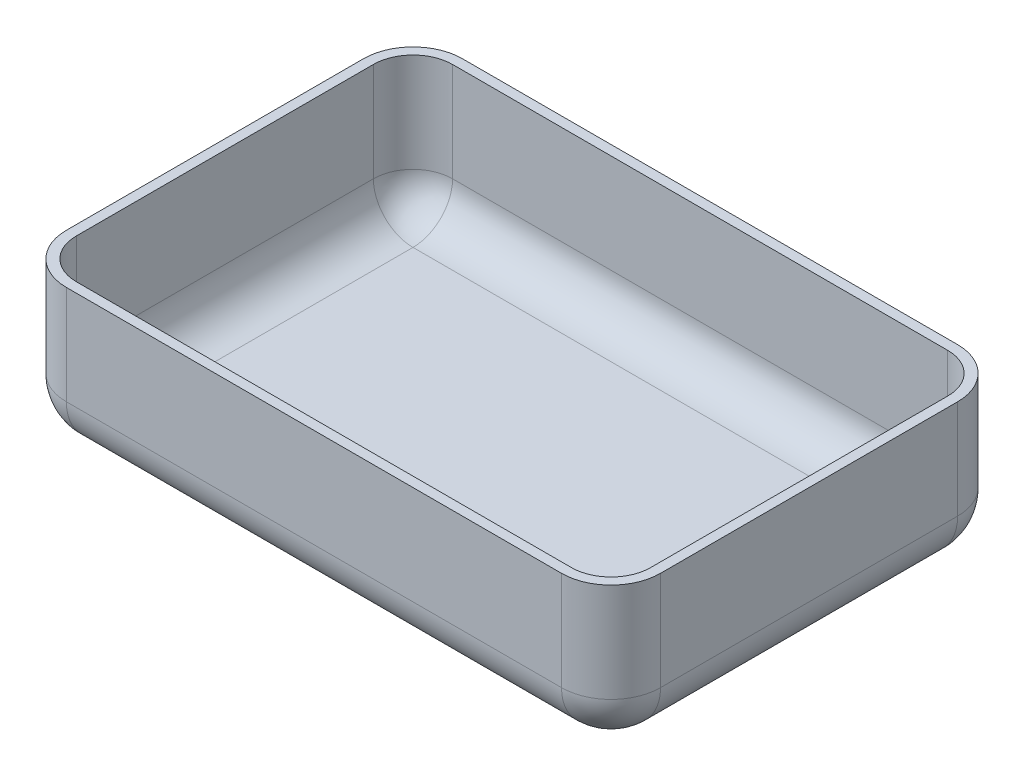
ISO-10303-21;
HEADER;
FILE_DESCRIPTION(('STEP AP214'),'2;1');
FILE_NAME('part.step','',(''),(''),'','','');
FILE_SCHEMA(('AUTOMOTIVE_DESIGN { 1 0 10303 214 1 1 1 1 }'));
ENDSEC;
DATA;
#1=APPLICATION_CONTEXT('core data for automotive mechanical design processes');
#2=APPLICATION_PROTOCOL_DEFINITION('international standard','automotive_design',2000,#1);
#3=PRODUCT_CONTEXT('',#1,'mechanical');
#4=PRODUCT('Part','Part','',(#3));
#5=PRODUCT_RELATED_PRODUCT_CATEGORY('part','',(#4));
#6=PRODUCT_DEFINITION_FORMATION('','',#4);
#7=PRODUCT_DEFINITION_CONTEXT('part definition',#1,'design');
#8=PRODUCT_DEFINITION('design','',#6,#7);
#9=PRODUCT_DEFINITION_SHAPE('','',#8);
#10=(LENGTH_UNIT() NAMED_UNIT(*) SI_UNIT(.MILLI.,.METRE.));
#11=(NAMED_UNIT(*) PLANE_ANGLE_UNIT() SI_UNIT($,.RADIAN.));
#12=(NAMED_UNIT(*) SI_UNIT($,.STERADIAN.) SOLID_ANGLE_UNIT());
#13=UNCERTAINTY_MEASURE_WITH_UNIT(LENGTH_MEASURE(1.E-05),#10,'distance_accuracy_value','');
#14=(GEOMETRIC_REPRESENTATION_CONTEXT(3) GLOBAL_UNCERTAINTY_ASSIGNED_CONTEXT((#13)) GLOBAL_UNIT_ASSIGNED_CONTEXT((#10,
#11,#12)) REPRESENTATION_CONTEXT('',''));
#15=CARTESIAN_POINT('',(0.,0.,0.));
#16=DIRECTION('',(0.,0.,1.));
#17=DIRECTION('',(1.,0.,0.));
#18=AXIS2_PLACEMENT_3D('',#15,#16,#17);
#19=CARTESIAN_POINT('',(-76.2,38.1,50.8));
#20=DIRECTION('',(1.,0.,0.));
#21=DIRECTION('',(0.,0.,-1.));
#22=AXIS2_PLACEMENT_3D('',#19,#20,#21);
#23=PLANE('',#22);
#24=DIRECTION('',(0.,0.,1.));
#25=VECTOR('',#24,1.);
#26=CARTESIAN_POINT('',(-76.2,38.1,50.8));
#27=LINE('',#26,#25);
#28=CARTESIAN_POINT('',(-76.2,38.1,-38.1));
#29=VERTEX_POINT('',#28);
#30=CARTESIAN_POINT('',(-76.2,38.1,38.1));
#31=VERTEX_POINT('',#30);
#32=EDGE_CURVE('E282',#29,#31,#27,.T.);
#33=ORIENTED_EDGE('',*,*,#32,.F.);
#34=DIRECTION('',(0.,-1.,0.));
#35=VECTOR('',#34,1.);
#36=CARTESIAN_POINT('',(-76.2,38.1,-38.1));
#37=LINE('',#36,#35);
#38=CARTESIAN_POINT('',(-76.2,12.7,-38.1));
#39=VERTEX_POINT('',#38);
#40=EDGE_CURVE('E299',#29,#39,#37,.T.);
#41=ORIENTED_EDGE('',*,*,#40,.T.);
#42=DIRECTION('',(0.,0.,1.));
#43=VECTOR('',#42,1.);
#44=CARTESIAN_POINT('',(-76.2,12.7,50.8));
#45=LINE('',#44,#43);
#46=CARTESIAN_POINT('',(-76.2,12.7,38.1));
#47=VERTEX_POINT('',#46);
#48=EDGE_CURVE('E296',#39,#47,#45,.T.);
#49=ORIENTED_EDGE('',*,*,#48,.T.);
#50=DIRECTION('',(0.,-1.,0.));
#51=VECTOR('',#50,1.);
#52=CARTESIAN_POINT('',(-76.2,38.1,38.1));
#53=LINE('',#52,#51);
#54=EDGE_CURVE('E294',#47,#31,#53,.F.);
#55=ORIENTED_EDGE('',*,*,#54,.T.);
#56=EDGE_LOOP('',(#33,#41,#49,#55));
#57=FACE_BOUND('',#56,.T.);
#58=ADVANCED_FACE('F39',(#57),#23,.F.);
#59=CARTESIAN_POINT('',(76.2,38.1,50.8));
#60=DIRECTION('',(0.,0.,-1.));
#61=DIRECTION('',(-1.,0.,0.));
#62=AXIS2_PLACEMENT_3D('',#59,#60,#61);
#63=PLANE('',#62);
#64=DIRECTION('',(1.,0.,0.));
#65=VECTOR('',#64,1.);
#66=CARTESIAN_POINT('',(76.2,12.7,50.8));
#67=LINE('',#66,#65);
#68=CARTESIAN_POINT('',(-63.5,12.7,50.8));
#69=VERTEX_POINT('',#68);
#70=CARTESIAN_POINT('',(63.5,12.7,50.8));
#71=VERTEX_POINT('',#70);
#72=EDGE_CURVE('E64',#69,#71,#67,.T.);
#73=ORIENTED_EDGE('',*,*,#72,.T.);
#74=DIRECTION('',(0.,-1.,0.));
#75=VECTOR('',#74,1.);
#76=CARTESIAN_POINT('',(63.5,38.1,50.8));
#77=LINE('',#76,#75);
#78=CARTESIAN_POINT('',(63.5,38.1,50.8));
#79=VERTEX_POINT('',#78);
#80=EDGE_CURVE('E325',#71,#79,#77,.F.);
#81=ORIENTED_EDGE('',*,*,#80,.T.);
#82=DIRECTION('',(1.,0.,0.));
#83=VECTOR('',#82,1.);
#84=CARTESIAN_POINT('',(76.2,38.1,50.8));
#85=LINE('',#84,#83);
#86=CARTESIAN_POINT('',(-63.5,38.1,50.8));
#87=VERTEX_POINT('',#86);
#88=EDGE_CURVE('E285',#87,#79,#85,.T.);
#89=ORIENTED_EDGE('',*,*,#88,.F.);
#90=DIRECTION('',(0.,-1.,0.));
#91=VECTOR('',#90,1.);
#92=CARTESIAN_POINT('',(-63.5,38.1,50.8));
#93=LINE('',#92,#91);
#94=EDGE_CURVE('E322',#87,#69,#93,.T.);
#95=ORIENTED_EDGE('',*,*,#94,.T.);
#96=EDGE_LOOP('',(#73,#81,#89,#95));
#97=FACE_BOUND('',#96,.T.);
#98=ADVANCED_FACE('F398',(#97),#63,.F.);
#99=CARTESIAN_POINT('',(76.2,38.1,50.8));
#100=DIRECTION('',(-1.,0.,0.));
#101=DIRECTION('',(0.,0.,1.));
#102=AXIS2_PLACEMENT_3D('',#99,#100,#101);
#103=PLANE('',#102);
#104=DIRECTION('',(0.,0.,-1.));
#105=VECTOR('',#104,1.);
#106=CARTESIAN_POINT('',(76.2,12.7,50.8));
#107=LINE('',#106,#105);
#108=CARTESIAN_POINT('',(76.2,12.7,38.1));
#109=VERTEX_POINT('',#108);
#110=CARTESIAN_POINT('',(76.2,12.7,-38.1));
#111=VERTEX_POINT('',#110);
#112=EDGE_CURVE('E318',#109,#111,#107,.T.);
#113=ORIENTED_EDGE('',*,*,#112,.T.);
#114=DIRECTION('',(0.,-1.,0.));
#115=VECTOR('',#114,1.);
#116=CARTESIAN_POINT('',(76.2,38.1,-38.1));
#117=LINE('',#116,#115);
#118=CARTESIAN_POINT('',(76.2,38.1,-38.1));
#119=VERTEX_POINT('',#118);
#120=EDGE_CURVE('E320',#111,#119,#117,.F.);
#121=ORIENTED_EDGE('',*,*,#120,.T.);
#122=DIRECTION('',(0.,0.,-1.));
#123=VECTOR('',#122,1.);
#124=CARTESIAN_POINT('',(76.2,38.1,50.8));
#125=LINE('',#124,#123);
#126=CARTESIAN_POINT('',(76.2,38.1,38.1));
#127=VERTEX_POINT('',#126);
#128=EDGE_CURVE('E288',#127,#119,#125,.T.);
#129=ORIENTED_EDGE('',*,*,#128,.F.);
#130=DIRECTION('',(0.,-1.,0.));
#131=VECTOR('',#130,1.);
#132=CARTESIAN_POINT('',(76.2,38.1,38.1));
#133=LINE('',#132,#131);
#134=EDGE_CURVE('E316',#127,#109,#133,.T.);
#135=ORIENTED_EDGE('',*,*,#134,.T.);
#136=EDGE_LOOP('',(#113,#121,#129,#135));
#137=FACE_BOUND('',#136,.T.);
#138=ADVANCED_FACE('F417',(#137),#103,.F.);
#139=CARTESIAN_POINT('',(76.2,38.1,-50.8));
#140=DIRECTION('',(0.,0.,1.));
#141=DIRECTION('',(1.,0.,0.));
#142=AXIS2_PLACEMENT_3D('',#139,#140,#141);
#143=PLANE('',#142);
#144=DIRECTION('',(-1.,0.,0.));
#145=VECTOR('',#144,1.);
#146=CARTESIAN_POINT('',(76.2,12.7,-50.8));
#147=LINE('',#146,#145);
#148=CARTESIAN_POINT('',(63.5,12.7,-50.8));
#149=VERTEX_POINT('',#148);
#150=CARTESIAN_POINT('',(-63.5,12.7,-50.8));
#151=VERTEX_POINT('',#150);
#152=EDGE_CURVE('E312',#149,#151,#147,.T.);
#153=ORIENTED_EDGE('',*,*,#152,.T.);
#154=DIRECTION('',(0.,-1.,0.));
#155=VECTOR('',#154,1.);
#156=CARTESIAN_POINT('',(-63.5,38.1,-50.8));
#157=LINE('',#156,#155);
#158=CARTESIAN_POINT('',(-63.5,38.1,-50.8));
#159=VERTEX_POINT('',#158);
#160=EDGE_CURVE('E314',#151,#159,#157,.F.);
#161=ORIENTED_EDGE('',*,*,#160,.T.);
#162=DIRECTION('',(-1.,0.,0.));
#163=VECTOR('',#162,1.);
#164=CARTESIAN_POINT('',(76.2,38.1,-50.8));
#165=LINE('',#164,#163);
#166=CARTESIAN_POINT('',(63.5,38.1,-50.8));
#167=VERTEX_POINT('',#166);
#168=EDGE_CURVE('E291',#167,#159,#165,.T.);
#169=ORIENTED_EDGE('',*,*,#168,.F.);
#170=DIRECTION('',(0.,-1.,0.));
#171=VECTOR('',#170,1.);
#172=CARTESIAN_POINT('',(63.5,38.1,-50.8));
#173=LINE('',#172,#171);
#174=EDGE_CURVE('E310',#167,#149,#173,.T.);
#175=ORIENTED_EDGE('',*,*,#174,.T.);
#176=EDGE_LOOP('',(#153,#161,#169,#175));
#177=FACE_BOUND('',#176,.T.);
#178=ADVANCED_FACE('F376',(#177),#143,.F.);
#179=CARTESIAN_POINT('',(0.,38.1,0.));
#180=DIRECTION('',(0.,1.,0.));
#181=DIRECTION('',(0.,0.,1.));
#182=AXIS2_PLACEMENT_3D('',#179,#180,#181);
#183=PLANE('',#182);
#184=DIRECTION('',(-1.,0.,0.));
#185=VECTOR('',#184,1.);
#186=CARTESIAN_POINT('',(76.2,38.1,-48.26));
#187=LINE('',#186,#185);
#188=CARTESIAN_POINT('',(63.5,38.1,-48.26));
#189=VERTEX_POINT('',#188);
#190=CARTESIAN_POINT('',(-63.5,38.1,-48.26));
#191=VERTEX_POINT('',#190);
#192=EDGE_CURVE('E215',#189,#191,#187,.T.);
#193=ORIENTED_EDGE('',*,*,#192,.F.);
#194=CARTESIAN_POINT('',(63.5,38.1,-38.1));
#195=DIRECTION('',(0.,1.,0.));
#196=DIRECTION('',(0.,0.,1.));
#197=AXIS2_PLACEMENT_3D('',#194,#195,#196);
#198=CIRCLE('',#197,10.16);
#199=CARTESIAN_POINT('',(73.66,38.1,-38.1));
#200=VERTEX_POINT('',#199);
#201=EDGE_CURVE('E275',#200,#189,#198,.T.);
#202=ORIENTED_EDGE('',*,*,#201,.F.);
#203=DIRECTION('',(0.,0.,-1.));
#204=VECTOR('',#203,1.);
#205=CARTESIAN_POINT('',(73.66,38.1,50.8));
#206=LINE('',#205,#204);
#207=CARTESIAN_POINT('',(73.66,38.1,38.1));
#208=VERTEX_POINT('',#207);
#209=EDGE_CURVE('E56',#208,#200,#206,.T.);
#210=ORIENTED_EDGE('',*,*,#209,.F.);
#211=CARTESIAN_POINT('',(63.5,38.1,38.1));
#212=DIRECTION('',(0.,1.,0.));
#213=DIRECTION('',(0.,0.,1.));
#214=AXIS2_PLACEMENT_3D('',#211,#212,#213);
#215=CIRCLE('',#214,10.16);
#216=CARTESIAN_POINT('',(63.5,38.1,48.26));
#217=VERTEX_POINT('',#216);
#218=EDGE_CURVE('E271',#217,#208,#215,.T.);
#219=ORIENTED_EDGE('',*,*,#218,.F.);
#220=DIRECTION('',(1.,0.,0.));
#221=VECTOR('',#220,1.);
#222=CARTESIAN_POINT('',(76.2,38.1,48.26));
#223=LINE('',#222,#221);
#224=CARTESIAN_POINT('',(-63.5,38.1,48.26));
#225=VERTEX_POINT('',#224);
#226=EDGE_CURVE('E269',#225,#217,#223,.T.);
#227=ORIENTED_EDGE('',*,*,#226,.F.);
#228=CARTESIAN_POINT('',(-63.5,38.1,38.1));
#229=DIRECTION('',(0.,1.,0.));
#230=DIRECTION('',(0.,0.,1.));
#231=AXIS2_PLACEMENT_3D('',#228,#229,#230);
#232=CIRCLE('',#231,10.16);
#233=CARTESIAN_POINT('',(-73.66,38.1,38.1));
#234=VERTEX_POINT('',#233);
#235=EDGE_CURVE('E238',#234,#225,#232,.T.);
#236=ORIENTED_EDGE('',*,*,#235,.F.);
#237=DIRECTION('',(0.,0.,1.));
#238=VECTOR('',#237,1.);
#239=CARTESIAN_POINT('',(-73.66,38.1,50.8));
#240=LINE('',#239,#238);
#241=CARTESIAN_POINT('',(-73.66,38.1,-38.1));
#242=VERTEX_POINT('',#241);
#243=EDGE_CURVE('E259',#242,#234,#240,.T.);
#244=ORIENTED_EDGE('',*,*,#243,.F.);
#245=CARTESIAN_POINT('',(-63.5,38.1,-38.1));
#246=DIRECTION('',(0.,1.,0.));
#247=DIRECTION('',(0.,0.,1.));
#248=AXIS2_PLACEMENT_3D('',#245,#246,#247);
#249=CIRCLE('',#248,10.16);
#250=EDGE_CURVE('E184',#191,#242,#249,.T.);
#251=ORIENTED_EDGE('',*,*,#250,.F.);
#252=EDGE_LOOP('',(#193,#202,#210,#219,#227,#236,#244,#251));
#253=FACE_BOUND('',#252,.T.);
#254=ORIENTED_EDGE('',*,*,#168,.T.);
#255=CARTESIAN_POINT('',(-63.5,38.1,-38.1));
#256=DIRECTION('',(0.,1.,0.));
#257=DIRECTION('',(0.,0.,1.));
#258=AXIS2_PLACEMENT_3D('',#255,#256,#257);
#259=CIRCLE('',#258,12.7);
#260=EDGE_CURVE('E11',#159,#29,#259,.T.);
#261=ORIENTED_EDGE('',*,*,#260,.T.);
#262=ORIENTED_EDGE('',*,*,#32,.T.);
#263=CARTESIAN_POINT('',(-63.5,38.1,38.1));
#264=DIRECTION('',(0.,1.,0.));
#265=DIRECTION('',(0.,0.,1.));
#266=AXIS2_PLACEMENT_3D('',#263,#264,#265);
#267=CIRCLE('',#266,12.7);
#268=EDGE_CURVE('E327',#31,#87,#267,.T.);
#269=ORIENTED_EDGE('',*,*,#268,.T.);
#270=ORIENTED_EDGE('',*,*,#88,.T.);
#271=CARTESIAN_POINT('',(63.5,38.1,38.1));
#272=DIRECTION('',(0.,1.,0.));
#273=DIRECTION('',(0.,0.,1.));
#274=AXIS2_PLACEMENT_3D('',#271,#272,#273);
#275=CIRCLE('',#274,12.7);
#276=EDGE_CURVE('E329',#79,#127,#275,.T.);
#277=ORIENTED_EDGE('',*,*,#276,.T.);
#278=ORIENTED_EDGE('',*,*,#128,.T.);
#279=CARTESIAN_POINT('',(63.5,38.1,-38.1));
#280=DIRECTION('',(0.,1.,0.));
#281=DIRECTION('',(0.,0.,1.));
#282=AXIS2_PLACEMENT_3D('',#279,#280,#281);
#283=CIRCLE('',#282,12.7);
#284=EDGE_CURVE('E48',#119,#167,#283,.T.);
#285=ORIENTED_EDGE('',*,*,#284,.T.);
#286=EDGE_LOOP('',(#254,#261,#262,#269,#270,#277,#278,#285));
#287=FACE_BOUND('',#286,.T.);
#288=ADVANCED_FACE('F387',(#253,#287),#183,.T.);
#289=CARTESIAN_POINT('',(0.,0.,0.));
#290=DIRECTION('',(0.,1.,0.));
#291=DIRECTION('',(0.,0.,1.));
#292=AXIS2_PLACEMENT_3D('',#289,#290,#291);
#293=PLANE('',#292);
#294=DIRECTION('',(1.,0.,0.));
#295=VECTOR('',#294,1.);
#296=CARTESIAN_POINT('',(0.,0.,38.1));
#297=LINE('',#296,#295);
#298=CARTESIAN_POINT('',(63.5,0.,38.1));
#299=VERTEX_POINT('',#298);
#300=CARTESIAN_POINT('',(-63.5,0.,38.1));
#301=VERTEX_POINT('',#300);
#302=EDGE_CURVE('E301',#299,#301,#297,.F.);
#303=ORIENTED_EDGE('',*,*,#302,.T.);
#304=DIRECTION('',(0.,0.,1.));
#305=VECTOR('',#304,1.);
#306=CARTESIAN_POINT('',(-63.5,0.,0.));
#307=LINE('',#306,#305);
#308=CARTESIAN_POINT('',(-63.5,0.,-38.1));
#309=VERTEX_POINT('',#308);
#310=EDGE_CURVE('E307',#301,#309,#307,.F.);
#311=ORIENTED_EDGE('',*,*,#310,.T.);
#312=DIRECTION('',(-1.,0.,0.));
#313=VECTOR('',#312,1.);
#314=CARTESIAN_POINT('',(0.,0.,-38.1));
#315=LINE('',#314,#313);
#316=CARTESIAN_POINT('',(63.5,0.,-38.1));
#317=VERTEX_POINT('',#316);
#318=EDGE_CURVE('E305',#309,#317,#315,.F.);
#319=ORIENTED_EDGE('',*,*,#318,.T.);
#320=DIRECTION('',(0.,0.,-1.));
#321=VECTOR('',#320,1.);
#322=CARTESIAN_POINT('',(63.5,0.,0.));
#323=LINE('',#322,#321);
#324=EDGE_CURVE('E303',#317,#299,#323,.F.);
#325=ORIENTED_EDGE('',*,*,#324,.T.);
#326=EDGE_LOOP('',(#303,#311,#319,#325));
#327=FACE_BOUND('',#326,.T.);
#328=ADVANCED_FACE('F413',(#327),#293,.F.);
#329=CARTESIAN_POINT('',(63.5,38.1,-38.1));
#330=DIRECTION('',(0.,-1.,0.));
#331=DIRECTION('',(0.,0.,-1.));
#332=AXIS2_PLACEMENT_3D('',#329,#330,#331);
#333=CYLINDRICAL_SURFACE('',#332,12.7);
#334=ORIENTED_EDGE('',*,*,#284,.F.);
#335=ORIENTED_EDGE('',*,*,#120,.F.);
#336=CARTESIAN_POINT('',(63.5,12.7,-38.1));
#337=DIRECTION('',(0.,-1.,0.));
#338=DIRECTION('',(0.,0.,-1.));
#339=AXIS2_PLACEMENT_3D('',#336,#337,#338);
#340=CIRCLE('',#339,12.7);
#341=EDGE_CURVE('E358',#149,#111,#340,.T.);
#342=ORIENTED_EDGE('',*,*,#341,.F.);
#343=ORIENTED_EDGE('',*,*,#174,.F.);
#344=EDGE_LOOP('',(#334,#335,#342,#343));
#345=FACE_BOUND('',#344,.T.);
#346=ADVANCED_FACE('F41',(#345),#333,.T.);
#347=CARTESIAN_POINT('',(63.5,38.1,38.1));
#348=DIRECTION('',(0.,-1.,0.));
#349=DIRECTION('',(0.,0.,-1.));
#350=AXIS2_PLACEMENT_3D('',#347,#348,#349);
#351=CYLINDRICAL_SURFACE('',#350,12.7);
#352=ORIENTED_EDGE('',*,*,#276,.F.);
#353=ORIENTED_EDGE('',*,*,#80,.F.);
#354=CARTESIAN_POINT('',(63.5,12.7,38.1));
#355=DIRECTION('',(0.,-1.,0.));
#356=DIRECTION('',(0.,0.,-1.));
#357=AXIS2_PLACEMENT_3D('',#354,#355,#356);
#358=CIRCLE('',#357,12.7);
#359=EDGE_CURVE('E356',#109,#71,#358,.T.);
#360=ORIENTED_EDGE('',*,*,#359,.F.);
#361=ORIENTED_EDGE('',*,*,#134,.F.);
#362=EDGE_LOOP('',(#352,#353,#360,#361));
#363=FACE_BOUND('',#362,.T.);
#364=ADVANCED_FACE('F401',(#363),#351,.T.);
#365=CARTESIAN_POINT('',(63.5,12.7,50.8));
#366=DIRECTION('',(0.,0.,-1.));
#367=DIRECTION('',(-1.,0.,0.));
#368=AXIS2_PLACEMENT_3D('',#365,#366,#367);
#369=CYLINDRICAL_SURFACE('',#368,12.7);
#370=CARTESIAN_POINT('',(63.5,12.7,-38.1));
#371=DIRECTION('',(0.,0.,-1.));
#372=DIRECTION('',(-1.,0.,0.));
#373=AXIS2_PLACEMENT_3D('',#370,#371,#372);
#374=CIRCLE('',#373,12.7);
#375=EDGE_CURVE('E43',#111,#317,#374,.T.);
#376=ORIENTED_EDGE('',*,*,#375,.F.);
#377=ORIENTED_EDGE('',*,*,#112,.F.);
#378=CARTESIAN_POINT('',(63.5,12.7,38.1));
#379=DIRECTION('',(0.,0.,1.));
#380=DIRECTION('',(1.,0.,0.));
#381=AXIS2_PLACEMENT_3D('',#378,#379,#380);
#382=CIRCLE('',#381,12.7);
#383=EDGE_CURVE('E353',#299,#109,#382,.T.);
#384=ORIENTED_EDGE('',*,*,#383,.F.);
#385=ORIENTED_EDGE('',*,*,#324,.F.);
#386=EDGE_LOOP('',(#376,#377,#384,#385));
#387=FACE_BOUND('',#386,.T.);
#388=ADVANCED_FACE('F414',(#387),#369,.T.);
#389=CARTESIAN_POINT('',(63.5,12.7,-38.1));
#390=DIRECTION('',(1.,0.,0.));
#391=DIRECTION('',(0.,0.,-1.));
#392=AXIS2_PLACEMENT_3D('',#389,#390,#391);
#393=SPHERICAL_SURFACE('',#392,12.7);
#394=ORIENTED_EDGE('',*,*,#341,.T.);
#395=ORIENTED_EDGE('',*,*,#375,.T.);
#396=CARTESIAN_POINT('',(63.5,12.7,-38.1));
#397=DIRECTION('',(1.,0.,0.));
#398=DIRECTION('',(0.,0.,-1.));
#399=AXIS2_PLACEMENT_3D('',#396,#397,#398);
#400=CIRCLE('',#399,12.7);
#401=EDGE_CURVE('E350',#149,#317,#400,.F.);
#402=ORIENTED_EDGE('',*,*,#401,.F.);
#403=EDGE_LOOP('',(#394,#395,#402));
#404=FACE_BOUND('',#403,.T.);
#405=ADVANCED_FACE('F365',(#404),#393,.T.);
#406=CARTESIAN_POINT('',(63.5,12.7,38.1));
#407=DIRECTION('',(1.,0.,0.));
#408=DIRECTION('',(0.,0.,-1.));
#409=AXIS2_PLACEMENT_3D('',#406,#407,#408);
#410=SPHERICAL_SURFACE('',#409,12.7);
#411=ORIENTED_EDGE('',*,*,#383,.T.);
#412=ORIENTED_EDGE('',*,*,#359,.T.);
#413=CARTESIAN_POINT('',(63.5,12.7,38.1));
#414=DIRECTION('',(1.,0.,0.));
#415=DIRECTION('',(0.,0.,-1.));
#416=AXIS2_PLACEMENT_3D('',#413,#414,#415);
#417=CIRCLE('',#416,12.7);
#418=EDGE_CURVE('E347',#299,#71,#417,.F.);
#419=ORIENTED_EDGE('',*,*,#418,.F.);
#420=EDGE_LOOP('',(#411,#412,#419));
#421=FACE_BOUND('',#420,.T.);
#422=ADVANCED_FACE('F405',(#421),#410,.T.);
#423=CARTESIAN_POINT('',(76.2,12.7,-38.1));
#424=DIRECTION('',(-1.,0.,0.));
#425=DIRECTION('',(0.,0.,1.));
#426=AXIS2_PLACEMENT_3D('',#423,#424,#425);
#427=CYLINDRICAL_SURFACE('',#426,12.7);
#428=ORIENTED_EDGE('',*,*,#401,.T.);
#429=ORIENTED_EDGE('',*,*,#318,.F.);
#430=CARTESIAN_POINT('',(-63.5,12.7,-38.1));
#431=DIRECTION('',(-1.,0.,0.));
#432=DIRECTION('',(0.,0.,1.));
#433=AXIS2_PLACEMENT_3D('',#430,#431,#432);
#434=CIRCLE('',#433,12.7);
#435=EDGE_CURVE('E344',#151,#309,#434,.T.);
#436=ORIENTED_EDGE('',*,*,#435,.F.);
#437=ORIENTED_EDGE('',*,*,#152,.F.);
#438=EDGE_LOOP('',(#428,#429,#436,#437));
#439=FACE_BOUND('',#438,.T.);
#440=ADVANCED_FACE('F372',(#439),#427,.T.);
#441=CARTESIAN_POINT('',(-63.5,38.1,-38.1));
#442=DIRECTION('',(0.,-1.,0.));
#443=DIRECTION('',(0.,0.,-1.));
#444=AXIS2_PLACEMENT_3D('',#441,#442,#443);
#445=CYLINDRICAL_SURFACE('',#444,12.7);
#446=ORIENTED_EDGE('',*,*,#260,.F.);
#447=ORIENTED_EDGE('',*,*,#160,.F.);
#448=CARTESIAN_POINT('',(-63.5,12.7,-38.1));
#449=DIRECTION('',(0.,-1.,0.));
#450=DIRECTION('',(0.,0.,-1.));
#451=AXIS2_PLACEMENT_3D('',#448,#449,#450);
#452=CIRCLE('',#451,12.7);
#453=EDGE_CURVE('E341',#39,#151,#452,.T.);
#454=ORIENTED_EDGE('',*,*,#453,.F.);
#455=ORIENTED_EDGE('',*,*,#40,.F.);
#456=EDGE_LOOP('',(#446,#447,#454,#455));
#457=FACE_BOUND('',#456,.T.);
#458=ADVANCED_FACE('F382',(#457),#445,.T.);
#459=CARTESIAN_POINT('',(-63.5,38.1,38.1));
#460=DIRECTION('',(0.,-1.,0.));
#461=DIRECTION('',(0.,0.,-1.));
#462=AXIS2_PLACEMENT_3D('',#459,#460,#461);
#463=CYLINDRICAL_SURFACE('',#462,12.7);
#464=ORIENTED_EDGE('',*,*,#268,.F.);
#465=ORIENTED_EDGE('',*,*,#54,.F.);
#466=CARTESIAN_POINT('',(-63.5,12.7,38.1));
#467=DIRECTION('',(0.,-1.,0.));
#468=DIRECTION('',(0.,0.,-1.));
#469=AXIS2_PLACEMENT_3D('',#466,#467,#468);
#470=CIRCLE('',#469,12.7);
#471=EDGE_CURVE('E338',#69,#47,#470,.T.);
#472=ORIENTED_EDGE('',*,*,#471,.F.);
#473=ORIENTED_EDGE('',*,*,#94,.F.);
#474=EDGE_LOOP('',(#464,#465,#472,#473));
#475=FACE_BOUND('',#474,.T.);
#476=ADVANCED_FACE('F394',(#475),#463,.T.);
#477=CARTESIAN_POINT('',(76.2,12.7,38.1));
#478=DIRECTION('',(1.,0.,0.));
#479=DIRECTION('',(0.,0.,-1.));
#480=AXIS2_PLACEMENT_3D('',#477,#478,#479);
#481=CYLINDRICAL_SURFACE('',#480,12.7);
#482=ORIENTED_EDGE('',*,*,#418,.T.);
#483=ORIENTED_EDGE('',*,*,#72,.F.);
#484=CARTESIAN_POINT('',(-63.5,12.7,38.1));
#485=DIRECTION('',(-1.,0.,0.));
#486=DIRECTION('',(0.,0.,1.));
#487=AXIS2_PLACEMENT_3D('',#484,#485,#486);
#488=CIRCLE('',#487,12.7);
#489=EDGE_CURVE('E335',#301,#69,#488,.T.);
#490=ORIENTED_EDGE('',*,*,#489,.F.);
#491=ORIENTED_EDGE('',*,*,#302,.F.);
#492=EDGE_LOOP('',(#482,#483,#490,#491));
#493=FACE_BOUND('',#492,.T.);
#494=ADVANCED_FACE('F409',(#493),#481,.T.);
#495=CARTESIAN_POINT('',(-63.5,12.7,-38.1));
#496=DIRECTION('',(0.,0.,-1.));
#497=DIRECTION('',(-1.,0.,0.));
#498=AXIS2_PLACEMENT_3D('',#495,#496,#497);
#499=SPHERICAL_SURFACE('',#498,12.7);
#500=ORIENTED_EDGE('',*,*,#453,.T.);
#501=ORIENTED_EDGE('',*,*,#435,.T.);
#502=CARTESIAN_POINT('',(-63.5,12.7,-38.1));
#503=DIRECTION('',(0.,0.,-1.));
#504=DIRECTION('',(-1.,0.,0.));
#505=AXIS2_PLACEMENT_3D('',#502,#503,#504);
#506=CIRCLE('',#505,12.7);
#507=EDGE_CURVE('E333',#39,#309,#506,.F.);
#508=ORIENTED_EDGE('',*,*,#507,.F.);
#509=EDGE_LOOP('',(#500,#501,#508));
#510=FACE_BOUND('',#509,.T.);
#511=ADVANCED_FACE('F442',(#510),#499,.T.);
#512=CARTESIAN_POINT('',(-63.5,12.7,38.1));
#513=DIRECTION('',(0.,0.,1.));
#514=DIRECTION('',(1.,0.,0.));
#515=AXIS2_PLACEMENT_3D('',#512,#513,#514);
#516=SPHERICAL_SURFACE('',#515,12.7);
#517=ORIENTED_EDGE('',*,*,#489,.T.);
#518=ORIENTED_EDGE('',*,*,#471,.T.);
#519=CARTESIAN_POINT('',(-63.5,12.7,38.1));
#520=DIRECTION('',(0.,0.,1.));
#521=DIRECTION('',(1.,0.,0.));
#522=AXIS2_PLACEMENT_3D('',#519,#520,#521);
#523=CIRCLE('',#522,12.7);
#524=EDGE_CURVE('E281',#301,#47,#523,.F.);
#525=ORIENTED_EDGE('',*,*,#524,.F.);
#526=EDGE_LOOP('',(#517,#518,#525));
#527=FACE_BOUND('',#526,.T.);
#528=ADVANCED_FACE('F438',(#527),#516,.T.);
#529=CARTESIAN_POINT('',(-63.5,12.7,50.8));
#530=DIRECTION('',(0.,0.,1.));
#531=DIRECTION('',(1.,0.,0.));
#532=AXIS2_PLACEMENT_3D('',#529,#530,#531);
#533=CYLINDRICAL_SURFACE('',#532,12.7);
#534=ORIENTED_EDGE('',*,*,#507,.T.);
#535=ORIENTED_EDGE('',*,*,#310,.F.);
#536=ORIENTED_EDGE('',*,*,#524,.T.);
#537=ORIENTED_EDGE('',*,*,#48,.F.);
#538=EDGE_LOOP('',(#534,#535,#536,#537));
#539=FACE_BOUND('',#538,.T.);
#540=ADVANCED_FACE('F435',(#539),#533,.T.);
#541=CARTESIAN_POINT('',(-73.66,38.1,50.8));
#542=DIRECTION('',(1.,0.,0.));
#543=DIRECTION('',(0.,0.,-1.));
#544=AXIS2_PLACEMENT_3D('',#541,#542,#543);
#545=PLANE('',#544);
#546=ORIENTED_EDGE('',*,*,#243,.T.);
#547=DIRECTION('',(0.,1.,0.));
#548=VECTOR('',#547,1.);
#549=CARTESIAN_POINT('',(-73.66,38.1,38.1));
#550=LINE('',#549,#548);
#551=CARTESIAN_POINT('',(-73.66,12.7,38.1));
#552=VERTEX_POINT('',#551);
#553=EDGE_CURVE('E213',#552,#234,#550,.T.);
#554=ORIENTED_EDGE('',*,*,#553,.F.);
#555=DIRECTION('',(0.,0.,-1.));
#556=VECTOR('',#555,1.);
#557=CARTESIAN_POINT('',(-73.66,12.7,50.8));
#558=LINE('',#557,#556);
#559=CARTESIAN_POINT('',(-73.66,12.7,-38.1));
#560=VERTEX_POINT('',#559);
#561=EDGE_CURVE('E190',#560,#552,#558,.F.);
#562=ORIENTED_EDGE('',*,*,#561,.F.);
#563=DIRECTION('',(0.,1.,0.));
#564=VECTOR('',#563,1.);
#565=CARTESIAN_POINT('',(-73.66,38.1,-38.1));
#566=LINE('',#565,#564);
#567=EDGE_CURVE('E179',#242,#560,#566,.F.);
#568=ORIENTED_EDGE('',*,*,#567,.F.);
#569=EDGE_LOOP('',(#546,#554,#562,#568));
#570=FACE_BOUND('',#569,.T.);
#571=ADVANCED_FACE('F212',(#570),#545,.T.);
#572=CARTESIAN_POINT('',(76.2,38.1,48.26));
#573=DIRECTION('',(0.,0.,-1.));
#574=DIRECTION('',(-1.,0.,0.));
#575=AXIS2_PLACEMENT_3D('',#572,#573,#574);
#576=PLANE('',#575);
#577=DIRECTION('',(-1.,0.,0.));
#578=VECTOR('',#577,1.);
#579=CARTESIAN_POINT('',(76.2,12.7,48.26));
#580=LINE('',#579,#578);
#581=CARTESIAN_POINT('',(-63.5,12.7,48.26));
#582=VERTEX_POINT('',#581);
#583=CARTESIAN_POINT('',(63.5,12.7,48.26));
#584=VERTEX_POINT('',#583);
#585=EDGE_CURVE('E239',#582,#584,#580,.F.);
#586=ORIENTED_EDGE('',*,*,#585,.F.);
#587=DIRECTION('',(0.,1.,0.));
#588=VECTOR('',#587,1.);
#589=CARTESIAN_POINT('',(-63.5,38.1,48.26));
#590=LINE('',#589,#588);
#591=EDGE_CURVE('E227',#225,#582,#590,.F.);
#592=ORIENTED_EDGE('',*,*,#591,.F.);
#593=ORIENTED_EDGE('',*,*,#226,.T.);
#594=DIRECTION('',(0.,1.,0.));
#595=VECTOR('',#594,1.);
#596=CARTESIAN_POINT('',(63.5,38.1,48.26));
#597=LINE('',#596,#595);
#598=EDGE_CURVE('E236',#584,#217,#597,.T.);
#599=ORIENTED_EDGE('',*,*,#598,.F.);
#600=EDGE_LOOP('',(#586,#592,#593,#599));
#601=FACE_BOUND('',#600,.T.);
#602=ADVANCED_FACE('F526',(#601),#576,.T.);
#603=CARTESIAN_POINT('',(73.66,38.1,50.8));
#604=DIRECTION('',(-1.,0.,0.));
#605=DIRECTION('',(0.,0.,1.));
#606=AXIS2_PLACEMENT_3D('',#603,#604,#605);
#607=PLANE('',#606);
#608=DIRECTION('',(0.,0.,1.));
#609=VECTOR('',#608,1.);
#610=CARTESIAN_POINT('',(73.66,12.7,50.8));
#611=LINE('',#610,#609);
#612=CARTESIAN_POINT('',(73.66,12.7,38.1));
#613=VERTEX_POINT('',#612);
#614=CARTESIAN_POINT('',(73.66,12.7,-38.1));
#615=VERTEX_POINT('',#614);
#616=EDGE_CURVE('E228',#613,#615,#611,.F.);
#617=ORIENTED_EDGE('',*,*,#616,.F.);
#618=DIRECTION('',(0.,1.,0.));
#619=VECTOR('',#618,1.);
#620=CARTESIAN_POINT('',(73.66,38.1,38.1));
#621=LINE('',#620,#619);
#622=EDGE_CURVE('E219',#208,#613,#621,.F.);
#623=ORIENTED_EDGE('',*,*,#622,.F.);
#624=ORIENTED_EDGE('',*,*,#209,.T.);
#625=DIRECTION('',(0.,1.,0.));
#626=VECTOR('',#625,1.);
#627=CARTESIAN_POINT('',(73.66,38.1,-38.1));
#628=LINE('',#627,#626);
#629=EDGE_CURVE('E225',#615,#200,#628,.T.);
#630=ORIENTED_EDGE('',*,*,#629,.F.);
#631=EDGE_LOOP('',(#617,#623,#624,#630));
#632=FACE_BOUND('',#631,.T.);
#633=ADVANCED_FACE('F534',(#632),#607,.T.);
#634=CARTESIAN_POINT('',(76.2,38.1,-48.26));
#635=DIRECTION('',(0.,0.,1.));
#636=DIRECTION('',(1.,0.,0.));
#637=AXIS2_PLACEMENT_3D('',#634,#635,#636);
#638=PLANE('',#637);
#639=DIRECTION('',(1.,0.,0.));
#640=VECTOR('',#639,1.);
#641=CARTESIAN_POINT('',(76.2,12.7,-48.26));
#642=LINE('',#641,#640);
#643=CARTESIAN_POINT('',(63.5,12.7,-48.26));
#644=VERTEX_POINT('',#643);
#645=CARTESIAN_POINT('',(-63.5,12.7,-48.26));
#646=VERTEX_POINT('',#645);
#647=EDGE_CURVE('E220',#644,#646,#642,.F.);
#648=ORIENTED_EDGE('',*,*,#647,.F.);
#649=DIRECTION('',(0.,1.,0.));
#650=VECTOR('',#649,1.);
#651=CARTESIAN_POINT('',(63.5,38.1,-48.26));
#652=LINE('',#651,#650);
#653=EDGE_CURVE('E223',#189,#644,#652,.F.);
#654=ORIENTED_EDGE('',*,*,#653,.F.);
#655=ORIENTED_EDGE('',*,*,#192,.T.);
#656=DIRECTION('',(0.,1.,0.));
#657=VECTOR('',#656,1.);
#658=CARTESIAN_POINT('',(-63.5,38.1,-48.26));
#659=LINE('',#658,#657);
#660=EDGE_CURVE('E218',#646,#191,#659,.T.);
#661=ORIENTED_EDGE('',*,*,#660,.F.);
#662=EDGE_LOOP('',(#648,#654,#655,#661));
#663=FACE_BOUND('',#662,.T.);
#664=ADVANCED_FACE('F543',(#663),#638,.T.);
#665=CARTESIAN_POINT('',(0.,2.54,0.));
#666=DIRECTION('',(0.,1.,0.));
#667=DIRECTION('',(0.,0.,1.));
#668=AXIS2_PLACEMENT_3D('',#665,#666,#667);
#669=PLANE('',#668);
#670=DIRECTION('',(1.,0.,0.));
#671=VECTOR('',#670,1.);
#672=CARTESIAN_POINT('',(0.,2.54,38.1));
#673=LINE('',#672,#671);
#674=CARTESIAN_POINT('',(63.5,2.54,38.1));
#675=VERTEX_POINT('',#674);
#676=CARTESIAN_POINT('',(-63.5,2.54,38.1));
#677=VERTEX_POINT('',#676);
#678=EDGE_CURVE('E189',#675,#677,#673,.F.);
#679=ORIENTED_EDGE('',*,*,#678,.F.);
#680=DIRECTION('',(0.,0.,1.));
#681=VECTOR('',#680,1.);
#682=CARTESIAN_POINT('',(63.5,2.54,0.));
#683=LINE('',#682,#681);
#684=CARTESIAN_POINT('',(63.5,2.54,-38.1));
#685=VERTEX_POINT('',#684);
#686=EDGE_CURVE('E252',#685,#675,#683,.T.);
#687=ORIENTED_EDGE('',*,*,#686,.F.);
#688=DIRECTION('',(1.,0.,0.));
#689=VECTOR('',#688,1.);
#690=CARTESIAN_POINT('',(0.,2.54,-38.1));
#691=LINE('',#690,#689);
#692=CARTESIAN_POINT('',(-63.5,2.54,-38.1));
#693=VERTEX_POINT('',#692);
#694=EDGE_CURVE('E254',#693,#685,#691,.T.);
#695=ORIENTED_EDGE('',*,*,#694,.F.);
#696=DIRECTION('',(0.,0.,1.));
#697=VECTOR('',#696,1.);
#698=CARTESIAN_POINT('',(-63.5,2.54,0.));
#699=LINE('',#698,#697);
#700=EDGE_CURVE('E207',#677,#693,#699,.F.);
#701=ORIENTED_EDGE('',*,*,#700,.F.);
#702=EDGE_LOOP('',(#679,#687,#695,#701));
#703=FACE_BOUND('',#702,.T.);
#704=ADVANCED_FACE('F551',(#703),#669,.T.);
#705=CARTESIAN_POINT('',(63.5,38.1,-38.1));
#706=DIRECTION('',(0.,-1.,0.));
#707=DIRECTION('',(0.,0.,-1.));
#708=AXIS2_PLACEMENT_3D('',#705,#706,#707);
#709=CYLINDRICAL_SURFACE('',#708,10.16);
#710=ORIENTED_EDGE('',*,*,#201,.T.);
#711=ORIENTED_EDGE('',*,*,#653,.T.);
#712=CARTESIAN_POINT('',(63.5,12.7,-38.1));
#713=DIRECTION('',(0.,-1.,0.));
#714=DIRECTION('',(0.,0.,-1.));
#715=AXIS2_PLACEMENT_3D('',#712,#713,#714);
#716=CIRCLE('',#715,10.16);
#717=EDGE_CURVE('E229',#644,#615,#716,.T.);
#718=ORIENTED_EDGE('',*,*,#717,.T.);
#719=ORIENTED_EDGE('',*,*,#629,.T.);
#720=EDGE_LOOP('',(#710,#711,#718,#719));
#721=FACE_BOUND('',#720,.T.);
#722=ADVANCED_FACE('F560',(#721),#709,.F.);
#723=CARTESIAN_POINT('',(63.5,38.1,38.1));
#724=DIRECTION('',(0.,-1.,0.));
#725=DIRECTION('',(0.,0.,-1.));
#726=AXIS2_PLACEMENT_3D('',#723,#724,#725);
#727=CYLINDRICAL_SURFACE('',#726,10.16);
#728=ORIENTED_EDGE('',*,*,#218,.T.);
#729=ORIENTED_EDGE('',*,*,#622,.T.);
#730=CARTESIAN_POINT('',(63.5,12.7,38.1));
#731=DIRECTION('',(0.,1.,0.));
#732=DIRECTION('',(0.,0.,1.));
#733=AXIS2_PLACEMENT_3D('',#730,#731,#732);
#734=CIRCLE('',#733,10.16);
#735=EDGE_CURVE('E233',#613,#584,#734,.F.);
#736=ORIENTED_EDGE('',*,*,#735,.T.);
#737=ORIENTED_EDGE('',*,*,#598,.T.);
#738=EDGE_LOOP('',(#728,#729,#736,#737));
#739=FACE_BOUND('',#738,.T.);
#740=ADVANCED_FACE('F569',(#739),#727,.F.);
#741=CARTESIAN_POINT('',(63.5,12.7,50.8));
#742=DIRECTION('',(0.,0.,-1.));
#743=DIRECTION('',(-1.,0.,0.));
#744=AXIS2_PLACEMENT_3D('',#741,#742,#743);
#745=CYLINDRICAL_SURFACE('',#744,10.16);
#746=CARTESIAN_POINT('',(63.5,12.7,-38.1));
#747=DIRECTION('',(0.,0.,1.));
#748=DIRECTION('',(0.,-1.,0.));
#749=AXIS2_PLACEMENT_3D('',#746,#747,#748);
#750=CIRCLE('',#749,10.16);
#751=EDGE_CURVE('E232',#615,#685,#750,.F.);
#752=ORIENTED_EDGE('',*,*,#751,.T.);
#753=ORIENTED_EDGE('',*,*,#686,.T.);
#754=CARTESIAN_POINT('',(63.5,12.7,38.1));
#755=DIRECTION('',(0.,0.,1.));
#756=DIRECTION('',(0.,-1.,0.));
#757=AXIS2_PLACEMENT_3D('',#754,#755,#756);
#758=CIRCLE('',#757,10.16);
#759=EDGE_CURVE('E242',#675,#613,#758,.T.);
#760=ORIENTED_EDGE('',*,*,#759,.T.);
#761=ORIENTED_EDGE('',*,*,#616,.T.);
#762=EDGE_LOOP('',(#752,#753,#760,#761));
#763=FACE_BOUND('',#762,.T.);
#764=ADVANCED_FACE('F578',(#763),#745,.F.);
#765=CARTESIAN_POINT('',(63.5,12.7,-38.1));
#766=DIRECTION('',(1.,0.,0.));
#767=DIRECTION('',(0.,0.,-1.));
#768=AXIS2_PLACEMENT_3D('',#765,#766,#767);
#769=SPHERICAL_SURFACE('',#768,10.16);
#770=ORIENTED_EDGE('',*,*,#717,.F.);
#771=CARTESIAN_POINT('',(63.5,12.7,-38.1));
#772=DIRECTION('',(-1.,0.,0.));
#773=DIRECTION('',(0.,0.,1.));
#774=AXIS2_PLACEMENT_3D('',#771,#772,#773);
#775=CIRCLE('',#774,10.16);
#776=EDGE_CURVE('E247',#644,#685,#775,.T.);
#777=ORIENTED_EDGE('',*,*,#776,.T.);
#778=ORIENTED_EDGE('',*,*,#751,.F.);
#779=EDGE_LOOP('',(#770,#777,#778));
#780=FACE_BOUND('',#779,.T.);
#781=ADVANCED_FACE('F587',(#780),#769,.F.);
#782=CARTESIAN_POINT('',(63.5,12.7,38.1));
#783=DIRECTION('',(1.,0.,0.));
#784=DIRECTION('',(0.,0.,-1.));
#785=AXIS2_PLACEMENT_3D('',#782,#783,#784);
#786=SPHERICAL_SURFACE('',#785,10.16);
#787=ORIENTED_EDGE('',*,*,#759,.F.);
#788=CARTESIAN_POINT('',(63.5,12.7,38.1));
#789=DIRECTION('',(1.,0.,0.));
#790=DIRECTION('',(0.,0.,-1.));
#791=AXIS2_PLACEMENT_3D('',#788,#789,#790);
#792=CIRCLE('',#791,10.16);
#793=EDGE_CURVE('E248',#675,#584,#792,.F.);
#794=ORIENTED_EDGE('',*,*,#793,.T.);
#795=ORIENTED_EDGE('',*,*,#735,.F.);
#796=EDGE_LOOP('',(#787,#794,#795));
#797=FACE_BOUND('',#796,.T.);
#798=ADVANCED_FACE('F596',(#797),#786,.F.);
#799=CARTESIAN_POINT('',(76.2,12.7,-38.1));
#800=DIRECTION('',(-1.,0.,0.));
#801=DIRECTION('',(0.,0.,1.));
#802=AXIS2_PLACEMENT_3D('',#799,#800,#801);
#803=CYLINDRICAL_SURFACE('',#802,10.16);
#804=ORIENTED_EDGE('',*,*,#776,.F.);
#805=ORIENTED_EDGE('',*,*,#647,.T.);
#806=CARTESIAN_POINT('',(-63.5,12.7,-38.1));
#807=DIRECTION('',(1.,0.,0.));
#808=DIRECTION('',(0.,1.,0.));
#809=AXIS2_PLACEMENT_3D('',#806,#807,#808);
#810=CIRCLE('',#809,10.16);
#811=EDGE_CURVE('E198',#646,#693,#810,.F.);
#812=ORIENTED_EDGE('',*,*,#811,.T.);
#813=ORIENTED_EDGE('',*,*,#694,.T.);
#814=EDGE_LOOP('',(#804,#805,#812,#813));
#815=FACE_BOUND('',#814,.T.);
#816=ADVANCED_FACE('F605',(#815),#803,.F.);
#817=CARTESIAN_POINT('',(-63.5,38.1,-38.1));
#818=DIRECTION('',(0.,-1.,0.));
#819=DIRECTION('',(0.,0.,-1.));
#820=AXIS2_PLACEMENT_3D('',#817,#818,#819);
#821=CYLINDRICAL_SURFACE('',#820,10.16);
#822=ORIENTED_EDGE('',*,*,#250,.T.);
#823=ORIENTED_EDGE('',*,*,#567,.T.);
#824=CARTESIAN_POINT('',(-63.5,12.7,-38.1));
#825=DIRECTION('',(0.,-1.,0.));
#826=DIRECTION('',(0.,0.,-1.));
#827=AXIS2_PLACEMENT_3D('',#824,#825,#826);
#828=CIRCLE('',#827,10.16);
#829=EDGE_CURVE('E182',#560,#646,#828,.T.);
#830=ORIENTED_EDGE('',*,*,#829,.T.);
#831=ORIENTED_EDGE('',*,*,#660,.T.);
#832=EDGE_LOOP('',(#822,#823,#830,#831));
#833=FACE_BOUND('',#832,.T.);
#834=ADVANCED_FACE('F181',(#833),#821,.F.);
#835=CARTESIAN_POINT('',(-63.5,38.1,38.1));
#836=DIRECTION('',(0.,-1.,0.));
#837=DIRECTION('',(0.,0.,-1.));
#838=AXIS2_PLACEMENT_3D('',#835,#836,#837);
#839=CYLINDRICAL_SURFACE('',#838,10.16);
#840=ORIENTED_EDGE('',*,*,#235,.T.);
#841=ORIENTED_EDGE('',*,*,#591,.T.);
#842=CARTESIAN_POINT('',(-63.5,12.7,38.1));
#843=DIRECTION('',(0.,1.,0.));
#844=DIRECTION('',(-1.,0.,0.));
#845=AXIS2_PLACEMENT_3D('',#842,#843,#844);
#846=CIRCLE('',#845,10.16);
#847=EDGE_CURVE('E199',#582,#552,#846,.F.);
#848=ORIENTED_EDGE('',*,*,#847,.T.);
#849=ORIENTED_EDGE('',*,*,#553,.T.);
#850=EDGE_LOOP('',(#840,#841,#848,#849));
#851=FACE_BOUND('',#850,.T.);
#852=ADVANCED_FACE('F622',(#851),#839,.F.);
#853=CARTESIAN_POINT('',(76.2,12.7,38.1));
#854=DIRECTION('',(1.,0.,0.));
#855=DIRECTION('',(0.,0.,-1.));
#856=AXIS2_PLACEMENT_3D('',#853,#854,#855);
#857=CYLINDRICAL_SURFACE('',#856,10.16);
#858=ORIENTED_EDGE('',*,*,#793,.F.);
#859=ORIENTED_EDGE('',*,*,#678,.T.);
#860=CARTESIAN_POINT('',(-63.5,12.7,38.1));
#861=DIRECTION('',(-1.,0.,0.));
#862=DIRECTION('',(0.,0.,1.));
#863=AXIS2_PLACEMENT_3D('',#860,#861,#862);
#864=CIRCLE('',#863,10.16);
#865=EDGE_CURVE('E208',#677,#582,#864,.T.);
#866=ORIENTED_EDGE('',*,*,#865,.T.);
#867=ORIENTED_EDGE('',*,*,#585,.T.);
#868=EDGE_LOOP('',(#858,#859,#866,#867));
#869=FACE_BOUND('',#868,.T.);
#870=ADVANCED_FACE('F630',(#869),#857,.F.);
#871=CARTESIAN_POINT('',(-63.5,12.7,-38.1));
#872=DIRECTION('',(0.,0.,-1.));
#873=DIRECTION('',(-1.,0.,0.));
#874=AXIS2_PLACEMENT_3D('',#871,#872,#873);
#875=SPHERICAL_SURFACE('',#874,10.16);
#876=ORIENTED_EDGE('',*,*,#829,.F.);
#877=CARTESIAN_POINT('',(-63.5,12.7,-38.1));
#878=DIRECTION('',(0.,0.,1.));
#879=DIRECTION('',(1.,0.,0.));
#880=AXIS2_PLACEMENT_3D('',#877,#878,#879);
#881=CIRCLE('',#880,10.16);
#882=EDGE_CURVE('E196',#560,#693,#881,.T.);
#883=ORIENTED_EDGE('',*,*,#882,.T.);
#884=ORIENTED_EDGE('',*,*,#811,.F.);
#885=EDGE_LOOP('',(#876,#883,#884));
#886=FACE_BOUND('',#885,.T.);
#887=ADVANCED_FACE('F195',(#886),#875,.F.);
#888=CARTESIAN_POINT('',(-63.5,12.7,38.1));
#889=DIRECTION('',(0.,0.,1.));
#890=DIRECTION('',(1.,0.,0.));
#891=AXIS2_PLACEMENT_3D('',#888,#889,#890);
#892=SPHERICAL_SURFACE('',#891,10.16);
#893=ORIENTED_EDGE('',*,*,#865,.F.);
#894=CARTESIAN_POINT('',(-63.5,12.7,38.1));
#895=DIRECTION('',(0.,0.,1.));
#896=DIRECTION('',(1.,0.,0.));
#897=AXIS2_PLACEMENT_3D('',#894,#895,#896);
#898=CIRCLE('',#897,10.16);
#899=EDGE_CURVE('E209',#677,#552,#898,.F.);
#900=ORIENTED_EDGE('',*,*,#899,.T.);
#901=ORIENTED_EDGE('',*,*,#847,.F.);
#902=EDGE_LOOP('',(#893,#900,#901));
#903=FACE_BOUND('',#902,.T.);
#904=ADVANCED_FACE('F647',(#903),#892,.F.);
#905=CARTESIAN_POINT('',(-63.5,12.7,50.8));
#906=DIRECTION('',(0.,0.,1.));
#907=DIRECTION('',(1.,0.,0.));
#908=AXIS2_PLACEMENT_3D('',#905,#906,#907);
#909=CYLINDRICAL_SURFACE('',#908,10.16);
#910=ORIENTED_EDGE('',*,*,#882,.F.);
#911=ORIENTED_EDGE('',*,*,#561,.T.);
#912=ORIENTED_EDGE('',*,*,#899,.F.);
#913=ORIENTED_EDGE('',*,*,#700,.T.);
#914=EDGE_LOOP('',(#910,#911,#912,#913));
#915=FACE_BOUND('',#914,.T.);
#916=ADVANCED_FACE('F204',(#915),#909,.F.);
#917=CLOSED_SHELL('',(#58,#98,#138,#178,#288,#328,#346,#364,#388,#405,#422,#440,#458,#476,#494,
#511,#528,#540,#571,#602,#633,#664,#704,#722,#740,#764,#781,#798,#816,#834,#852,#870,#887,#904,#916));
#918=MANIFOLD_SOLID_BREP('B2',#917);
#919=ADVANCED_BREP_SHAPE_REPRESENTATION('',(#18,#918),#14);
#920=SHAPE_DEFINITION_REPRESENTATION(#9,#919);
ENDSEC;
END-ISO-10303-21;
